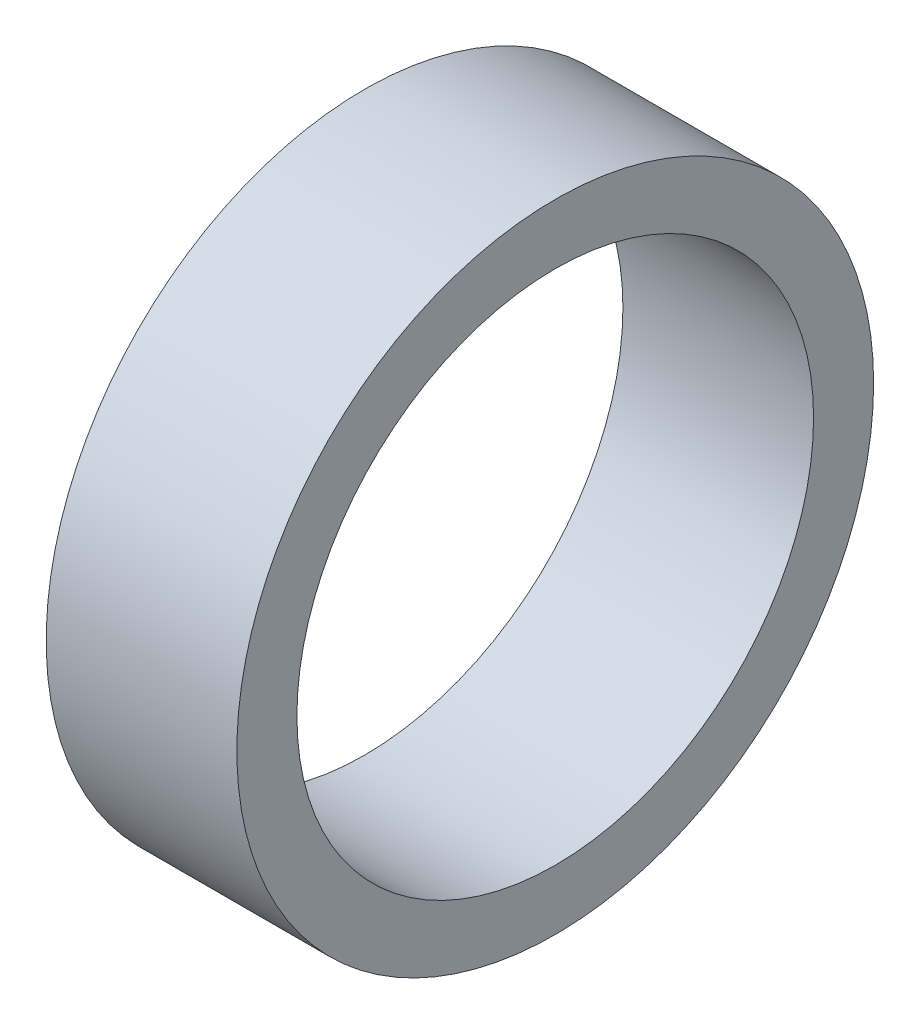
ISO-10303-21;
HEADER;
FILE_DESCRIPTION(('STEP AP214'),'2;1');
FILE_NAME('part.step','',(''),(''),'','','');
FILE_SCHEMA(('AUTOMOTIVE_DESIGN { 1 0 10303 214 1 1 1 1 }'));
ENDSEC;
DATA;
#1=APPLICATION_CONTEXT('core data for automotive mechanical design processes');
#2=APPLICATION_PROTOCOL_DEFINITION('international standard','automotive_design',2000,#1);
#3=PRODUCT_CONTEXT('',#1,'mechanical');
#4=PRODUCT('Part','Part','',(#3));
#5=PRODUCT_RELATED_PRODUCT_CATEGORY('part','',(#4));
#6=PRODUCT_DEFINITION_FORMATION('','',#4);
#7=PRODUCT_DEFINITION_CONTEXT('part definition',#1,'design');
#8=PRODUCT_DEFINITION('design','',#6,#7);
#9=PRODUCT_DEFINITION_SHAPE('','',#8);
#10=(LENGTH_UNIT() NAMED_UNIT(*) SI_UNIT(.MILLI.,.METRE.));
#11=(NAMED_UNIT(*) PLANE_ANGLE_UNIT() SI_UNIT($,.RADIAN.));
#12=(NAMED_UNIT(*) SI_UNIT($,.STERADIAN.) SOLID_ANGLE_UNIT());
#13=UNCERTAINTY_MEASURE_WITH_UNIT(LENGTH_MEASURE(1.E-05),#10,'distance_accuracy_value','');
#14=(GEOMETRIC_REPRESENTATION_CONTEXT(3) GLOBAL_UNCERTAINTY_ASSIGNED_CONTEXT((#13)) GLOBAL_UNIT_ASSIGNED_CONTEXT((#10,
#11,#12)) REPRESENTATION_CONTEXT('',''));
#15=CARTESIAN_POINT('',(0.,0.,0.));
#16=DIRECTION('',(0.,0.,1.));
#17=DIRECTION('',(1.,0.,0.));
#18=AXIS2_PLACEMENT_3D('',#15,#16,#17);
#19=CARTESIAN_POINT('',(10.,0.,0.));
#20=DIRECTION('',(1.,0.,0.));
#21=DIRECTION('',(0.,0.,-1.));
#22=AXIS2_PLACEMENT_3D('',#19,#20,#21);
#23=PLANE('',#22);
#24=CARTESIAN_POINT('',(10.,0.,0.));
#25=DIRECTION('',(1.,0.,0.));
#26=DIRECTION('',(0.,0.,-1.));
#27=AXIS2_PLACEMENT_3D('',#24,#25,#26);
#28=CIRCLE('',#27,33.4);
#29=CARTESIAN_POINT('',(10.,0.,-33.4));
#30=VERTEX_POINT('',#29);
#31=EDGE_CURVE('E10',#30,#30,#28,.T.);
#32=ORIENTED_EDGE('',*,*,#31,.T.);
#33=EDGE_LOOP('',(#32));
#34=FACE_BOUND('',#33,.T.);
#35=CARTESIAN_POINT('',(10.,0.,0.));
#36=DIRECTION('',(1.,0.,0.));
#37=DIRECTION('',(0.,0.,-1.));
#38=AXIS2_PLACEMENT_3D('',#35,#36,#37);
#39=CIRCLE('',#38,27.1);
#40=CARTESIAN_POINT('',(10.,0.,-27.1));
#41=VERTEX_POINT('',#40);
#42=EDGE_CURVE('E54',#41,#41,#39,.T.);
#43=ORIENTED_EDGE('',*,*,#42,.F.);
#44=EDGE_LOOP('',(#43));
#45=FACE_BOUND('',#44,.T.);
#46=ADVANCED_FACE('F41',(#34,#45),#23,.T.);
#47=CARTESIAN_POINT('',(-10.,0.,0.));
#48=DIRECTION('',(1.,0.,0.));
#49=DIRECTION('',(0.,0.,-1.));
#50=AXIS2_PLACEMENT_3D('',#47,#48,#49);
#51=PLANE('',#50);
#52=CARTESIAN_POINT('',(-10.,0.,0.));
#53=DIRECTION('',(1.,0.,0.));
#54=DIRECTION('',(0.,0.,-1.));
#55=AXIS2_PLACEMENT_3D('',#52,#53,#54);
#56=CIRCLE('',#55,33.4);
#57=CARTESIAN_POINT('',(-10.,0.,-33.4));
#58=VERTEX_POINT('',#57);
#59=EDGE_CURVE('E45',#58,#58,#56,.T.);
#60=ORIENTED_EDGE('',*,*,#59,.F.);
#61=EDGE_LOOP('',(#60));
#62=FACE_BOUND('',#61,.T.);
#63=CARTESIAN_POINT('',(-10.,0.,0.));
#64=DIRECTION('',(1.,0.,0.));
#65=DIRECTION('',(0.,0.,-1.));
#66=AXIS2_PLACEMENT_3D('',#63,#64,#65);
#67=CIRCLE('',#66,27.1);
#68=CARTESIAN_POINT('',(-10.,0.,-27.1));
#69=VERTEX_POINT('',#68);
#70=EDGE_CURVE('E56',#69,#69,#67,.T.);
#71=ORIENTED_EDGE('',*,*,#70,.T.);
#72=EDGE_LOOP('',(#71));
#73=FACE_BOUND('',#72,.T.);
#74=ADVANCED_FACE('F68',(#62,#73),#51,.F.);
#75=CARTESIAN_POINT('',(10.,0.,0.));
#76=DIRECTION('',(-1.,0.,0.));
#77=DIRECTION('',(0.,0.,1.));
#78=AXIS2_PLACEMENT_3D('',#75,#76,#77);
#79=CYLINDRICAL_SURFACE('',#78,33.4);
#80=ORIENTED_EDGE('',*,*,#31,.F.);
#81=EDGE_LOOP('',(#80));
#82=FACE_BOUND('',#81,.T.);
#83=ORIENTED_EDGE('',*,*,#59,.T.);
#84=EDGE_LOOP('',(#83));
#85=FACE_BOUND('',#84,.T.);
#86=ADVANCED_FACE('F43',(#82,#85),#79,.T.);
#87=CARTESIAN_POINT('',(10.,0.,0.));
#88=DIRECTION('',(-1.,0.,0.));
#89=DIRECTION('',(0.,0.,1.));
#90=AXIS2_PLACEMENT_3D('',#87,#88,#89);
#91=CYLINDRICAL_SURFACE('',#90,27.1);
#92=ORIENTED_EDGE('',*,*,#42,.T.);
#93=EDGE_LOOP('',(#92));
#94=FACE_BOUND('',#93,.T.);
#95=ORIENTED_EDGE('',*,*,#70,.F.);
#96=EDGE_LOOP('',(#95));
#97=FACE_BOUND('',#96,.T.);
#98=ADVANCED_FACE('F64',(#94,#97),#91,.F.);
#99=CLOSED_SHELL('',(#46,#74,#86,#98));
#100=MANIFOLD_SOLID_BREP('B2',#99);
#101=ADVANCED_BREP_SHAPE_REPRESENTATION('',(#18,#100),#14);
#102=SHAPE_DEFINITION_REPRESENTATION(#9,#101);
ENDSEC;
END-ISO-10303-21;
